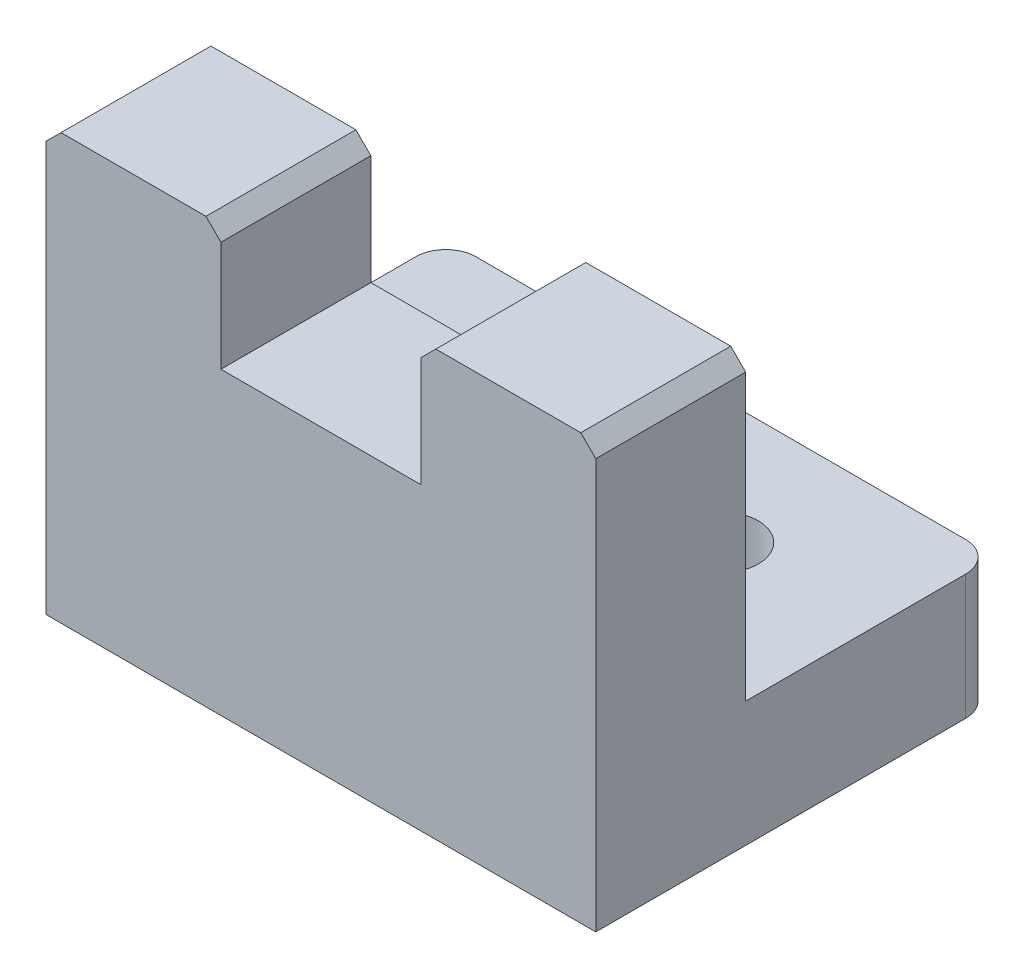
ISO-10303-21;
HEADER;
FILE_DESCRIPTION(('STEP AP214'),'2;1');
FILE_NAME('part.step','',(''),(''),'','','');
FILE_SCHEMA(('AUTOMOTIVE_DESIGN { 1 0 10303 214 1 1 1 1 }'));
ENDSEC;
DATA;
#1=APPLICATION_CONTEXT('core data for automotive mechanical design processes');
#2=APPLICATION_PROTOCOL_DEFINITION('international standard','automotive_design',2000,#1);
#3=PRODUCT_CONTEXT('',#1,'mechanical');
#4=PRODUCT('Part','Part','',(#3));
#5=PRODUCT_RELATED_PRODUCT_CATEGORY('part','',(#4));
#6=PRODUCT_DEFINITION_FORMATION('','',#4);
#7=PRODUCT_DEFINITION_CONTEXT('part definition',#1,'design');
#8=PRODUCT_DEFINITION('design','',#6,#7);
#9=PRODUCT_DEFINITION_SHAPE('','',#8);
#10=(LENGTH_UNIT() NAMED_UNIT(*) SI_UNIT(.MILLI.,.METRE.));
#11=(NAMED_UNIT(*) PLANE_ANGLE_UNIT() SI_UNIT($,.RADIAN.));
#12=(NAMED_UNIT(*) SI_UNIT($,.STERADIAN.) SOLID_ANGLE_UNIT());
#13=UNCERTAINTY_MEASURE_WITH_UNIT(LENGTH_MEASURE(1.E-05),#10,'distance_accuracy_value','');
#14=(GEOMETRIC_REPRESENTATION_CONTEXT(3) GLOBAL_UNCERTAINTY_ASSIGNED_CONTEXT((#13)) GLOBAL_UNIT_ASSIGNED_CONTEXT((#10,
#11,#12)) REPRESENTATION_CONTEXT('',''));
#15=CARTESIAN_POINT('',(0.,0.,0.));
#16=DIRECTION('',(0.,0.,1.));
#17=DIRECTION('',(1.,0.,0.));
#18=AXIS2_PLACEMENT_3D('',#15,#16,#17);
#19=CARTESIAN_POINT('',(0.,72.5,0.));
#20=DIRECTION('',(0.,-1.,0.));
#21=DIRECTION('',(0.,0.,-1.));
#22=AXIS2_PLACEMENT_3D('',#19,#20,#21);
#23=PLANE('',#22);
#24=DIRECTION('',(1.,0.,0.));
#25=VECTOR('',#24,1.);
#26=CARTESIAN_POINT('',(-55.,72.5,40.));
#27=LINE('',#26,#25);
#28=CARTESIAN_POINT('',(23.,72.5,40.));
#29=VERTEX_POINT('',#28);
#30=CARTESIAN_POINT('',(52.,72.5,40.));
#31=VERTEX_POINT('',#30);
#32=EDGE_CURVE('E216',#29,#31,#27,.T.);
#33=ORIENTED_EDGE('',*,*,#32,.T.);
#34=DIRECTION('',(0.,0.,-1.));
#35=VECTOR('',#34,1.);
#36=CARTESIAN_POINT('',(52.,72.5,0.));
#37=LINE('',#36,#35);
#38=CARTESIAN_POINT('',(52.,72.5,10.));
#39=VERTEX_POINT('',#38);
#40=EDGE_CURVE('E263',#31,#39,#37,.T.);
#41=ORIENTED_EDGE('',*,*,#40,.T.);
#42=DIRECTION('',(-1.,0.,0.));
#43=VECTOR('',#42,1.);
#44=CARTESIAN_POINT('',(-55.,72.5,10.));
#45=LINE('',#44,#43);
#46=CARTESIAN_POINT('',(23.,72.5,10.));
#47=VERTEX_POINT('',#46);
#48=EDGE_CURVE('E220',#39,#47,#45,.T.);
#49=ORIENTED_EDGE('',*,*,#48,.T.);
#50=DIRECTION('',(0.,0.,1.));
#51=VECTOR('',#50,1.);
#52=CARTESIAN_POINT('',(23.,72.5,0.));
#53=LINE('',#52,#51);
#54=EDGE_CURVE('E260',#47,#29,#53,.T.);
#55=ORIENTED_EDGE('',*,*,#54,.T.);
#56=EDGE_LOOP('',(#33,#41,#49,#55));
#57=FACE_BOUND('',#56,.T.);
#58=ADVANCED_FACE('F47',(#57),#23,.F.);
#59=CARTESIAN_POINT('',(-55.,12.5,-40.));
#60=DIRECTION('',(1.,0.,0.));
#61=DIRECTION('',(0.,0.,-1.));
#62=AXIS2_PLACEMENT_3D('',#59,#60,#61);
#63=PLANE('',#62);
#64=DIRECTION('',(0.,0.,1.));
#65=VECTOR('',#64,1.);
#66=CARTESIAN_POINT('',(-55.,12.5,-40.));
#67=LINE('',#66,#65);
#68=CARTESIAN_POINT('',(-55.,12.5,-34.));
#69=VERTEX_POINT('',#68);
#70=CARTESIAN_POINT('',(-55.,12.5,10.));
#71=VERTEX_POINT('',#70);
#72=EDGE_CURVE('E232',#69,#71,#67,.T.);
#73=ORIENTED_EDGE('',*,*,#72,.F.);
#74=DIRECTION('',(0.,-1.,0.));
#75=VECTOR('',#74,1.);
#76=CARTESIAN_POINT('',(-55.,12.5,-34.));
#77=LINE('',#76,#75);
#78=CARTESIAN_POINT('',(-55.,-12.5,-34.));
#79=VERTEX_POINT('',#78);
#80=EDGE_CURVE('E310',#69,#79,#77,.T.);
#81=ORIENTED_EDGE('',*,*,#80,.T.);
#82=DIRECTION('',(0.,0.,1.));
#83=VECTOR('',#82,1.);
#84=CARTESIAN_POINT('',(-55.,-12.5,-40.));
#85=LINE('',#84,#83);
#86=CARTESIAN_POINT('',(-55.,-12.5,40.));
#87=VERTEX_POINT('',#86);
#88=EDGE_CURVE('E231',#79,#87,#85,.T.);
#89=ORIENTED_EDGE('',*,*,#88,.T.);
#90=DIRECTION('',(0.,-1.,0.));
#91=VECTOR('',#90,1.);
#92=CARTESIAN_POINT('',(-55.,12.5,40.));
#93=LINE('',#92,#91);
#94=CARTESIAN_POINT('',(-55.,69.5,40.));
#95=VERTEX_POINT('',#94);
#96=EDGE_CURVE('E256',#95,#87,#93,.T.);
#97=ORIENTED_EDGE('',*,*,#96,.F.);
#98=DIRECTION('',(0.,0.,-1.));
#99=VECTOR('',#98,1.);
#100=CARTESIAN_POINT('',(-55.,69.5,-40.));
#101=LINE('',#100,#99);
#102=CARTESIAN_POINT('',(-55.,69.5,10.));
#103=VERTEX_POINT('',#102);
#104=EDGE_CURVE('E304',#95,#103,#101,.T.);
#105=ORIENTED_EDGE('',*,*,#104,.T.);
#106=DIRECTION('',(0.,-1.,0.));
#107=VECTOR('',#106,1.);
#108=CARTESIAN_POINT('',(-55.,72.5,10.));
#109=LINE('',#108,#107);
#110=EDGE_CURVE('E224',#103,#71,#109,.T.);
#111=ORIENTED_EDGE('',*,*,#110,.T.);
#112=EDGE_LOOP('',(#73,#81,#89,#97,#105,#111));
#113=FACE_BOUND('',#112,.T.);
#114=ADVANCED_FACE('F337',(#113),#63,.F.);
#115=CARTESIAN_POINT('',(-55.,12.5,40.));
#116=DIRECTION('',(0.,0.,-1.));
#117=DIRECTION('',(-1.,0.,0.));
#118=AXIS2_PLACEMENT_3D('',#115,#116,#117);
#119=PLANE('',#118);
#120=DIRECTION('',(0.,-1.,0.));
#121=VECTOR('',#120,1.);
#122=CARTESIAN_POINT('',(55.,12.5,40.));
#123=LINE('',#122,#121);
#124=CARTESIAN_POINT('',(55.,69.5,40.));
#125=VERTEX_POINT('',#124);
#126=CARTESIAN_POINT('',(55.,-12.5,40.));
#127=VERTEX_POINT('',#126);
#128=EDGE_CURVE('E242',#125,#127,#123,.T.);
#129=ORIENTED_EDGE('',*,*,#128,.F.);
#130=DIRECTION('',(0.707106781186548,-0.707106781186548,0.));
#131=VECTOR('',#130,1.);
#132=CARTESIAN_POINT('',(52.,72.5,40.));
#133=LINE('',#132,#131);
#134=EDGE_CURVE('E290',#125,#31,#133,.F.);
#135=ORIENTED_EDGE('',*,*,#134,.T.);
#136=ORIENTED_EDGE('',*,*,#32,.F.);
#137=DIRECTION('',(0.707106781186548,0.707106781186548,0.));
#138=VECTOR('',#137,1.);
#139=CARTESIAN_POINT('',(20.,69.5,40.));
#140=LINE('',#139,#138);
#141=CARTESIAN_POINT('',(20.,69.5,40.));
#142=VERTEX_POINT('',#141);
#143=EDGE_CURVE('E172',#29,#142,#140,.F.);
#144=ORIENTED_EDGE('',*,*,#143,.T.);
#145=DIRECTION('',(0.,-1.,0.));
#146=VECTOR('',#145,1.);
#147=CARTESIAN_POINT('',(20.,72.5,40.));
#148=LINE('',#147,#146);
#149=CARTESIAN_POINT('',(20.,47.5,40.));
#150=VERTEX_POINT('',#149);
#151=EDGE_CURVE('E163',#142,#150,#148,.T.);
#152=ORIENTED_EDGE('',*,*,#151,.T.);
#153=DIRECTION('',(-1.,0.,0.));
#154=VECTOR('',#153,1.);
#155=CARTESIAN_POINT('',(20.,47.5,40.));
#156=LINE('',#155,#154);
#157=CARTESIAN_POINT('',(-20.,47.5,40.));
#158=VERTEX_POINT('',#157);
#159=EDGE_CURVE('E169',#150,#158,#156,.T.);
#160=ORIENTED_EDGE('',*,*,#159,.T.);
#161=DIRECTION('',(0.,1.,0.));
#162=VECTOR('',#161,1.);
#163=CARTESIAN_POINT('',(-20.,72.5,40.));
#164=LINE('',#163,#162);
#165=CARTESIAN_POINT('',(-20.,69.5,40.));
#166=VERTEX_POINT('',#165);
#167=EDGE_CURVE('E189',#158,#166,#164,.T.);
#168=ORIENTED_EDGE('',*,*,#167,.T.);
#169=DIRECTION('',(0.707106781186548,-0.707106781186548,0.));
#170=VECTOR('',#169,1.);
#171=CARTESIAN_POINT('',(-23.,72.5,40.));
#172=LINE('',#171,#170);
#173=CARTESIAN_POINT('',(-23.,72.5,40.));
#174=VERTEX_POINT('',#173);
#175=EDGE_CURVE('E282',#166,#174,#172,.F.);
#176=ORIENTED_EDGE('',*,*,#175,.T.);
#177=CARTESIAN_POINT('',(-52.,72.5,40.));
#178=VERTEX_POINT('',#177);
#179=EDGE_CURVE('E211',#178,#174,#27,.T.);
#180=ORIENTED_EDGE('',*,*,#179,.F.);
#181=DIRECTION('',(0.707106781186548,0.707106781186548,0.));
#182=VECTOR('',#181,1.);
#183=CARTESIAN_POINT('',(-52.,72.5,40.));
#184=LINE('',#183,#182);
#185=EDGE_CURVE('E285',#178,#95,#184,.F.);
#186=ORIENTED_EDGE('',*,*,#185,.T.);
#187=ORIENTED_EDGE('',*,*,#96,.T.);
#188=DIRECTION('',(1.,0.,0.));
#189=VECTOR('',#188,1.);
#190=CARTESIAN_POINT('',(-55.,-12.5,40.));
#191=LINE('',#190,#189);
#192=EDGE_CURVE('E245',#87,#127,#191,.T.);
#193=ORIENTED_EDGE('',*,*,#192,.T.);
#194=EDGE_LOOP('',(#129,#135,#136,#144,#152,#160,#168,#176,#180,#186,#187,#193));
#195=FACE_BOUND('',#194,.T.);
#196=ADVANCED_FACE('F166',(#195),#119,.F.);
#197=CARTESIAN_POINT('',(55.,12.5,-40.));
#198=DIRECTION('',(-1.,0.,0.));
#199=DIRECTION('',(0.,0.,1.));
#200=AXIS2_PLACEMENT_3D('',#197,#198,#199);
#201=PLANE('',#200);
#202=DIRECTION('',(0.,0.,-1.));
#203=VECTOR('',#202,1.);
#204=CARTESIAN_POINT('',(55.,-12.5,-40.));
#205=LINE('',#204,#203);
#206=CARTESIAN_POINT('',(55.,-12.5,-34.));
#207=VERTEX_POINT('',#206);
#208=EDGE_CURVE('E249',#127,#207,#205,.T.);
#209=ORIENTED_EDGE('',*,*,#208,.T.);
#210=DIRECTION('',(0.,-1.,0.));
#211=VECTOR('',#210,1.);
#212=CARTESIAN_POINT('',(55.,12.5,-34.));
#213=LINE('',#212,#211);
#214=CARTESIAN_POINT('',(55.,12.5,-34.));
#215=VERTEX_POINT('',#214);
#216=EDGE_CURVE('E11',#207,#215,#213,.F.);
#217=ORIENTED_EDGE('',*,*,#216,.T.);
#218=DIRECTION('',(0.,0.,-1.));
#219=VECTOR('',#218,1.);
#220=CARTESIAN_POINT('',(55.,12.5,-40.));
#221=LINE('',#220,#219);
#222=CARTESIAN_POINT('',(55.,12.5,10.));
#223=VERTEX_POINT('',#222);
#224=EDGE_CURVE('E235',#223,#215,#221,.T.);
#225=ORIENTED_EDGE('',*,*,#224,.F.);
#226=DIRECTION('',(0.,-1.,0.));
#227=VECTOR('',#226,1.);
#228=CARTESIAN_POINT('',(55.,72.5,10.));
#229=LINE('',#228,#227);
#230=CARTESIAN_POINT('',(55.,69.5,10.));
#231=VERTEX_POINT('',#230);
#232=EDGE_CURVE('E228',#231,#223,#229,.T.);
#233=ORIENTED_EDGE('',*,*,#232,.F.);
#234=DIRECTION('',(0.,0.,1.));
#235=VECTOR('',#234,1.);
#236=CARTESIAN_POINT('',(55.,69.5,-40.));
#237=LINE('',#236,#235);
#238=EDGE_CURVE('E279',#231,#125,#237,.T.);
#239=ORIENTED_EDGE('',*,*,#238,.T.);
#240=ORIENTED_EDGE('',*,*,#128,.T.);
#241=EDGE_LOOP('',(#209,#217,#225,#233,#239,#240));
#242=FACE_BOUND('',#241,.T.);
#243=ADVANCED_FACE('F350',(#242),#201,.F.);
#244=CARTESIAN_POINT('',(-55.,12.5,-40.));
#245=DIRECTION('',(0.,0.,1.));
#246=DIRECTION('',(1.,0.,0.));
#247=AXIS2_PLACEMENT_3D('',#244,#245,#246);
#248=PLANE('',#247);
#249=DIRECTION('',(-1.,0.,0.));
#250=VECTOR('',#249,1.);
#251=CARTESIAN_POINT('',(-55.,-12.5,-40.));
#252=LINE('',#251,#250);
#253=CARTESIAN_POINT('',(49.,-12.5,-40.));
#254=VERTEX_POINT('',#253);
#255=CARTESIAN_POINT('',(-49.,-12.5,-40.));
#256=VERTEX_POINT('',#255);
#257=EDGE_CURVE('E236',#254,#256,#252,.T.);
#258=ORIENTED_EDGE('',*,*,#257,.T.);
#259=DIRECTION('',(0.,-1.,0.));
#260=VECTOR('',#259,1.);
#261=CARTESIAN_POINT('',(-49.,12.5,-40.));
#262=LINE('',#261,#260);
#263=CARTESIAN_POINT('',(-49.,12.5,-40.));
#264=VERTEX_POINT('',#263);
#265=EDGE_CURVE('E69',#256,#264,#262,.F.);
#266=ORIENTED_EDGE('',*,*,#265,.T.);
#267=DIRECTION('',(-1.,0.,0.));
#268=VECTOR('',#267,1.);
#269=CARTESIAN_POINT('',(-55.,12.5,-40.));
#270=LINE('',#269,#268);
#271=CARTESIAN_POINT('',(49.,12.5,-40.));
#272=VERTEX_POINT('',#271);
#273=EDGE_CURVE('E239',#272,#264,#270,.T.);
#274=ORIENTED_EDGE('',*,*,#273,.F.);
#275=DIRECTION('',(0.,-1.,0.));
#276=VECTOR('',#275,1.);
#277=CARTESIAN_POINT('',(49.,12.5,-40.));
#278=LINE('',#277,#276);
#279=EDGE_CURVE('E320',#272,#254,#278,.T.);
#280=ORIENTED_EDGE('',*,*,#279,.T.);
#281=EDGE_LOOP('',(#258,#266,#274,#280));
#282=FACE_BOUND('',#281,.T.);
#283=ADVANCED_FACE('F345',(#282),#248,.F.);
#284=CARTESIAN_POINT('',(0.,12.5,0.));
#285=DIRECTION('',(0.,1.,0.));
#286=DIRECTION('',(0.,0.,1.));
#287=AXIS2_PLACEMENT_3D('',#284,#285,#286);
#288=PLANE('',#287);
#289=CARTESIAN_POINT('',(25.,12.5,-15.));
#290=DIRECTION('',(0.,1.,0.));
#291=DIRECTION('',(0.,0.,1.));
#292=AXIS2_PLACEMENT_3D('',#289,#290,#291);
#293=CIRCLE('',#292,7.49999999999999);
#294=CARTESIAN_POINT('',(25.,12.5,-7.50000000000001));
#295=VERTEX_POINT('',#294);
#296=EDGE_CURVE('E582',#295,#295,#293,.T.);
#297=ORIENTED_EDGE('',*,*,#296,.F.);
#298=EDGE_LOOP('',(#297));
#299=FACE_BOUND('',#298,.T.);
#300=CARTESIAN_POINT('',(-25.,12.5,-15.));
#301=DIRECTION('',(0.,1.,0.));
#302=DIRECTION('',(0.,0.,1.));
#303=AXIS2_PLACEMENT_3D('',#300,#301,#302);
#304=CIRCLE('',#303,7.49999999999999);
#305=CARTESIAN_POINT('',(-25.,12.5,-7.50000000000001));
#306=VERTEX_POINT('',#305);
#307=EDGE_CURVE('E574',#306,#306,#304,.T.);
#308=ORIENTED_EDGE('',*,*,#307,.F.);
#309=EDGE_LOOP('',(#308));
#310=FACE_BOUND('',#309,.T.);
#311=ORIENTED_EDGE('',*,*,#273,.T.);
#312=CARTESIAN_POINT('',(-49.,12.5,-34.));
#313=DIRECTION('',(0.,1.,0.));
#314=DIRECTION('',(0.,0.,1.));
#315=AXIS2_PLACEMENT_3D('',#312,#313,#314);
#316=CIRCLE('',#315,6.);
#317=EDGE_CURVE('E56',#264,#69,#316,.T.);
#318=ORIENTED_EDGE('',*,*,#317,.T.);
#319=ORIENTED_EDGE('',*,*,#72,.T.);
#320=DIRECTION('',(-1.,0.,0.));
#321=VECTOR('',#320,1.);
#322=CARTESIAN_POINT('',(-55.,12.5,10.));
#323=LINE('',#322,#321);
#324=EDGE_CURVE('E209',#223,#71,#323,.T.);
#325=ORIENTED_EDGE('',*,*,#324,.F.);
#326=ORIENTED_EDGE('',*,*,#224,.T.);
#327=CARTESIAN_POINT('',(49.,12.5,-34.));
#328=DIRECTION('',(0.,1.,0.));
#329=DIRECTION('',(0.,0.,1.));
#330=AXIS2_PLACEMENT_3D('',#327,#328,#329);
#331=CIRCLE('',#330,6.);
#332=EDGE_CURVE('E326',#215,#272,#331,.T.);
#333=ORIENTED_EDGE('',*,*,#332,.T.);
#334=EDGE_LOOP('',(#311,#318,#319,#325,#326,#333));
#335=FACE_BOUND('',#334,.T.);
#336=ADVANCED_FACE('F332',(#299,#310,#335),#288,.T.);
#337=CARTESIAN_POINT('',(0.,-12.5,0.));
#338=DIRECTION('',(0.,1.,0.));
#339=DIRECTION('',(0.,0.,1.));
#340=AXIS2_PLACEMENT_3D('',#337,#338,#339);
#341=PLANE('',#340);
#342=CARTESIAN_POINT('',(25.,-12.5,-15.));
#343=DIRECTION('',(0.,1.,0.));
#344=DIRECTION('',(0.,0.,1.));
#345=AXIS2_PLACEMENT_3D('',#342,#343,#344);
#346=CIRCLE('',#345,7.49999999999999);
#347=CARTESIAN_POINT('',(25.,-12.5,-7.50000000000001));
#348=VERTEX_POINT('',#347);
#349=EDGE_CURVE('E577',#348,#348,#346,.T.);
#350=ORIENTED_EDGE('',*,*,#349,.T.);
#351=EDGE_LOOP('',(#350));
#352=FACE_BOUND('',#351,.T.);
#353=CARTESIAN_POINT('',(-25.,-12.5,-15.));
#354=DIRECTION('',(0.,1.,0.));
#355=DIRECTION('',(0.,0.,1.));
#356=AXIS2_PLACEMENT_3D('',#353,#354,#355);
#357=CIRCLE('',#356,7.49999999999999);
#358=CARTESIAN_POINT('',(-25.,-12.5,-7.5));
#359=VERTEX_POINT('',#358);
#360=EDGE_CURVE('E202',#359,#359,#357,.T.);
#361=ORIENTED_EDGE('',*,*,#360,.T.);
#362=EDGE_LOOP('',(#361));
#363=FACE_BOUND('',#362,.T.);
#364=ORIENTED_EDGE('',*,*,#88,.F.);
#365=CARTESIAN_POINT('',(-49.,-12.5,-34.));
#366=DIRECTION('',(0.,1.,0.));
#367=DIRECTION('',(0.,0.,1.));
#368=AXIS2_PLACEMENT_3D('',#365,#366,#367);
#369=CIRCLE('',#368,6.);
#370=EDGE_CURVE('E317',#79,#256,#369,.F.);
#371=ORIENTED_EDGE('',*,*,#370,.T.);
#372=ORIENTED_EDGE('',*,*,#257,.F.);
#373=CARTESIAN_POINT('',(49.,-12.5,-34.));
#374=DIRECTION('',(0.,1.,0.));
#375=DIRECTION('',(0.,0.,1.));
#376=AXIS2_PLACEMENT_3D('',#373,#374,#375);
#377=CIRCLE('',#376,6.);
#378=EDGE_CURVE('E314',#254,#207,#377,.F.);
#379=ORIENTED_EDGE('',*,*,#378,.T.);
#380=ORIENTED_EDGE('',*,*,#208,.F.);
#381=ORIENTED_EDGE('',*,*,#192,.F.);
#382=EDGE_LOOP('',(#364,#371,#372,#379,#380,#381));
#383=FACE_BOUND('',#382,.T.);
#384=ADVANCED_FACE('F343',(#352,#363,#383),#341,.F.);
#385=CARTESIAN_POINT('',(-55.,72.5,10.));
#386=DIRECTION('',(0.,0.,1.));
#387=DIRECTION('',(1.,0.,0.));
#388=AXIS2_PLACEMENT_3D('',#385,#386,#387);
#389=PLANE('',#388);
#390=ORIENTED_EDGE('',*,*,#48,.F.);
#391=DIRECTION('',(-0.707106781186548,0.707106781186548,0.));
#392=VECTOR('',#391,1.);
#393=CARTESIAN_POINT('',(52.,72.5,10.));
#394=LINE('',#393,#392);
#395=EDGE_CURVE('E276',#39,#231,#394,.F.);
#396=ORIENTED_EDGE('',*,*,#395,.T.);
#397=ORIENTED_EDGE('',*,*,#232,.T.);
#398=ORIENTED_EDGE('',*,*,#324,.T.);
#399=ORIENTED_EDGE('',*,*,#110,.F.);
#400=DIRECTION('',(-0.707106781186548,-0.707106781186548,0.));
#401=VECTOR('',#400,1.);
#402=CARTESIAN_POINT('',(-52.,72.5,10.));
#403=LINE('',#402,#401);
#404=CARTESIAN_POINT('',(-52.,72.5,10.));
#405=VERTEX_POINT('',#404);
#406=EDGE_CURVE('E270',#103,#405,#403,.F.);
#407=ORIENTED_EDGE('',*,*,#406,.T.);
#408=CARTESIAN_POINT('',(-23.,72.5,10.));
#409=VERTEX_POINT('',#408);
#410=EDGE_CURVE('E215',#409,#405,#45,.T.);
#411=ORIENTED_EDGE('',*,*,#410,.F.);
#412=DIRECTION('',(-0.707106781186548,0.707106781186548,0.));
#413=VECTOR('',#412,1.);
#414=CARTESIAN_POINT('',(-23.,72.5,10.));
#415=LINE('',#414,#413);
#416=CARTESIAN_POINT('',(-20.,69.5,10.));
#417=VERTEX_POINT('',#416);
#418=EDGE_CURVE('E267',#409,#417,#415,.F.);
#419=ORIENTED_EDGE('',*,*,#418,.T.);
#420=DIRECTION('',(0.,1.,0.));
#421=VECTOR('',#420,1.);
#422=CARTESIAN_POINT('',(-20.,72.5,10.));
#423=LINE('',#422,#421);
#424=CARTESIAN_POINT('',(-20.,47.5,10.));
#425=VERTEX_POINT('',#424);
#426=EDGE_CURVE('E177',#425,#417,#423,.T.);
#427=ORIENTED_EDGE('',*,*,#426,.F.);
#428=DIRECTION('',(-1.,0.,0.));
#429=VECTOR('',#428,1.);
#430=CARTESIAN_POINT('',(20.,47.5,10.));
#431=LINE('',#430,#429);
#432=CARTESIAN_POINT('',(20.,47.5,10.));
#433=VERTEX_POINT('',#432);
#434=EDGE_CURVE('E201',#433,#425,#431,.T.);
#435=ORIENTED_EDGE('',*,*,#434,.F.);
#436=DIRECTION('',(0.,-1.,0.));
#437=VECTOR('',#436,1.);
#438=CARTESIAN_POINT('',(20.,72.5,10.));
#439=LINE('',#438,#437);
#440=CARTESIAN_POINT('',(20.,69.5,10.));
#441=VERTEX_POINT('',#440);
#442=EDGE_CURVE('E183',#441,#433,#439,.T.);
#443=ORIENTED_EDGE('',*,*,#442,.F.);
#444=DIRECTION('',(-0.707106781186548,-0.707106781186548,0.));
#445=VECTOR('',#444,1.);
#446=CARTESIAN_POINT('',(20.,69.5,10.));
#447=LINE('',#446,#445);
#448=EDGE_CURVE('E273',#441,#47,#447,.F.);
#449=ORIENTED_EDGE('',*,*,#448,.T.);
#450=EDGE_LOOP('',(#390,#396,#397,#398,#399,#407,#411,#419,#427,#435,#443,#449));
#451=FACE_BOUND('',#450,.T.);
#452=ADVANCED_FACE('F364',(#451),#389,.F.);
#453=ORIENTED_EDGE('',*,*,#410,.T.);
#454=DIRECTION('',(0.,0.,1.));
#455=VECTOR('',#454,1.);
#456=CARTESIAN_POINT('',(-52.,72.5,0.));
#457=LINE('',#456,#455);
#458=EDGE_CURVE('E300',#405,#178,#457,.T.);
#459=ORIENTED_EDGE('',*,*,#458,.T.);
#460=ORIENTED_EDGE('',*,*,#179,.T.);
#461=DIRECTION('',(0.,0.,-1.));
#462=VECTOR('',#461,1.);
#463=CARTESIAN_POINT('',(-23.,72.5,0.));
#464=LINE('',#463,#462);
#465=EDGE_CURVE('E296',#174,#409,#464,.T.);
#466=ORIENTED_EDGE('',*,*,#465,.T.);
#467=EDGE_LOOP('',(#453,#459,#460,#466));
#468=FACE_BOUND('',#467,.T.);
#469=ADVANCED_FACE('F366',(#468),#23,.F.);
#470=CARTESIAN_POINT('',(20.,72.5,40.));
#471=DIRECTION('',(1.,0.,0.));
#472=DIRECTION('',(0.,1.,0.));
#473=AXIS2_PLACEMENT_3D('',#470,#471,#472);
#474=PLANE('',#473);
#475=ORIENTED_EDGE('',*,*,#151,.F.);
#476=DIRECTION('',(0.,0.,-1.));
#477=VECTOR('',#476,1.);
#478=CARTESIAN_POINT('',(20.,69.5,40.));
#479=LINE('',#478,#477);
#480=EDGE_CURVE('E293',#142,#441,#479,.T.);
#481=ORIENTED_EDGE('',*,*,#480,.T.);
#482=ORIENTED_EDGE('',*,*,#442,.T.);
#483=DIRECTION('',(0.,0.,-1.));
#484=VECTOR('',#483,1.);
#485=CARTESIAN_POINT('',(20.,47.5,40.));
#486=LINE('',#485,#484);
#487=EDGE_CURVE('E180',#150,#433,#486,.T.);
#488=ORIENTED_EDGE('',*,*,#487,.F.);
#489=EDGE_LOOP('',(#475,#481,#482,#488));
#490=FACE_BOUND('',#489,.T.);
#491=ADVANCED_FACE('F181',(#490),#474,.F.);
#492=CARTESIAN_POINT('',(-20.,72.5,40.));
#493=DIRECTION('',(-1.,0.,0.));
#494=DIRECTION('',(0.,-1.,0.));
#495=AXIS2_PLACEMENT_3D('',#492,#493,#494);
#496=PLANE('',#495);
#497=ORIENTED_EDGE('',*,*,#426,.T.);
#498=DIRECTION('',(0.,0.,1.));
#499=VECTOR('',#498,1.);
#500=CARTESIAN_POINT('',(-20.,69.5,40.));
#501=LINE('',#500,#499);
#502=EDGE_CURVE('E307',#417,#166,#501,.T.);
#503=ORIENTED_EDGE('',*,*,#502,.T.);
#504=ORIENTED_EDGE('',*,*,#167,.F.);
#505=DIRECTION('',(0.,0.,-1.));
#506=VECTOR('',#505,1.);
#507=CARTESIAN_POINT('',(-20.,47.5,40.));
#508=LINE('',#507,#506);
#509=EDGE_CURVE('E188',#158,#425,#508,.T.);
#510=ORIENTED_EDGE('',*,*,#509,.T.);
#511=EDGE_LOOP('',(#497,#503,#504,#510));
#512=FACE_BOUND('',#511,.T.);
#513=ADVANCED_FACE('F374',(#512),#496,.F.);
#514=CARTESIAN_POINT('',(20.,47.5,40.));
#515=DIRECTION('',(0.,-1.,0.));
#516=DIRECTION('',(1.,0.,0.));
#517=AXIS2_PLACEMENT_3D('',#514,#515,#516);
#518=PLANE('',#517);
#519=ORIENTED_EDGE('',*,*,#434,.T.);
#520=ORIENTED_EDGE('',*,*,#509,.F.);
#521=ORIENTED_EDGE('',*,*,#159,.F.);
#522=ORIENTED_EDGE('',*,*,#487,.T.);
#523=EDGE_LOOP('',(#519,#520,#521,#522));
#524=FACE_BOUND('',#523,.T.);
#525=ADVANCED_FACE('F191',(#524),#518,.F.);
#526=CARTESIAN_POINT('',(52.,72.5,0.));
#527=DIRECTION('',(-0.707106781186548,-0.707106781186548,0.));
#528=DIRECTION('',(0.,0.,-1.));
#529=AXIS2_PLACEMENT_3D('',#526,#527,#528);
#530=PLANE('',#529);
#531=ORIENTED_EDGE('',*,*,#134,.F.);
#532=ORIENTED_EDGE('',*,*,#238,.F.);
#533=ORIENTED_EDGE('',*,*,#395,.F.);
#534=ORIENTED_EDGE('',*,*,#40,.F.);
#535=EDGE_LOOP('',(#531,#532,#533,#534));
#536=FACE_BOUND('',#535,.T.);
#537=ADVANCED_FACE('F384',(#536),#530,.F.);
#538=CARTESIAN_POINT('',(20.,69.5,40.));
#539=DIRECTION('',(0.707106781186547,-0.707106781186547,0.));
#540=DIRECTION('',(0.,0.,-1.));
#541=AXIS2_PLACEMENT_3D('',#538,#539,#540);
#542=PLANE('',#541);
#543=ORIENTED_EDGE('',*,*,#143,.F.);
#544=ORIENTED_EDGE('',*,*,#54,.F.);
#545=ORIENTED_EDGE('',*,*,#448,.F.);
#546=ORIENTED_EDGE('',*,*,#480,.F.);
#547=EDGE_LOOP('',(#543,#544,#545,#546));
#548=FACE_BOUND('',#547,.T.);
#549=ADVANCED_FACE('F382',(#548),#542,.F.);
#550=CARTESIAN_POINT('',(-52.,72.5,0.));
#551=DIRECTION('',(0.707106781186548,-0.707106781186548,0.));
#552=DIRECTION('',(0.,0.,1.));
#553=AXIS2_PLACEMENT_3D('',#550,#551,#552);
#554=PLANE('',#553);
#555=ORIENTED_EDGE('',*,*,#406,.F.);
#556=ORIENTED_EDGE('',*,*,#104,.F.);
#557=ORIENTED_EDGE('',*,*,#185,.F.);
#558=ORIENTED_EDGE('',*,*,#458,.F.);
#559=EDGE_LOOP('',(#555,#556,#557,#558));
#560=FACE_BOUND('',#559,.T.);
#561=ADVANCED_FACE('F359',(#560),#554,.F.);
#562=CARTESIAN_POINT('',(-23.,72.5,0.));
#563=DIRECTION('',(-0.707106781186548,-0.707106781186548,0.));
#564=DIRECTION('',(0.,0.,-1.));
#565=AXIS2_PLACEMENT_3D('',#562,#563,#564);
#566=PLANE('',#565);
#567=ORIENTED_EDGE('',*,*,#175,.F.);
#568=ORIENTED_EDGE('',*,*,#502,.F.);
#569=ORIENTED_EDGE('',*,*,#418,.F.);
#570=ORIENTED_EDGE('',*,*,#465,.F.);
#571=EDGE_LOOP('',(#567,#568,#569,#570));
#572=FACE_BOUND('',#571,.T.);
#573=ADVANCED_FACE('F370',(#572),#566,.F.);
#574=CARTESIAN_POINT('',(-49.,12.5,-34.));
#575=DIRECTION('',(0.,-1.,0.));
#576=DIRECTION('',(0.,0.,-1.));
#577=AXIS2_PLACEMENT_3D('',#574,#575,#576);
#578=CYLINDRICAL_SURFACE('',#577,6.);
#579=ORIENTED_EDGE('',*,*,#317,.F.);
#580=ORIENTED_EDGE('',*,*,#265,.F.);
#581=ORIENTED_EDGE('',*,*,#370,.F.);
#582=ORIENTED_EDGE('',*,*,#80,.F.);
#583=EDGE_LOOP('',(#579,#580,#581,#582));
#584=FACE_BOUND('',#583,.T.);
#585=ADVANCED_FACE('F340',(#584),#578,.T.);
#586=CARTESIAN_POINT('',(49.,12.5,-34.));
#587=DIRECTION('',(0.,-1.,0.));
#588=DIRECTION('',(0.,0.,-1.));
#589=AXIS2_PLACEMENT_3D('',#586,#587,#588);
#590=CYLINDRICAL_SURFACE('',#589,6.);
#591=ORIENTED_EDGE('',*,*,#332,.F.);
#592=ORIENTED_EDGE('',*,*,#216,.F.);
#593=ORIENTED_EDGE('',*,*,#378,.F.);
#594=ORIENTED_EDGE('',*,*,#279,.F.);
#595=EDGE_LOOP('',(#591,#592,#593,#594));
#596=FACE_BOUND('',#595,.T.);
#597=ADVANCED_FACE('F49',(#596),#590,.T.);
#598=CARTESIAN_POINT('',(-25.,12.5,-15.));
#599=DIRECTION('',(0.,1.,0.));
#600=DIRECTION('',(0.,0.,1.));
#601=AXIS2_PLACEMENT_3D('',#598,#599,#600);
#602=CYLINDRICAL_SURFACE('',#601,7.49999999999999);
#603=ORIENTED_EDGE('',*,*,#360,.F.);
#604=EDGE_LOOP('',(#603));
#605=FACE_BOUND('',#604,.T.);
#606=ORIENTED_EDGE('',*,*,#307,.T.);
#607=EDGE_LOOP('',(#606));
#608=FACE_BOUND('',#607,.T.);
#609=ADVANCED_FACE('F439',(#605,#608),#602,.F.);
#610=CARTESIAN_POINT('',(25.,12.5,-15.));
#611=DIRECTION('',(0.,1.,0.));
#612=DIRECTION('',(0.,0.,1.));
#613=AXIS2_PLACEMENT_3D('',#610,#611,#612);
#614=CYLINDRICAL_SURFACE('',#613,7.49999999999999);
#615=ORIENTED_EDGE('',*,*,#349,.F.);
#616=EDGE_LOOP('',(#615));
#617=FACE_BOUND('',#616,.T.);
#618=ORIENTED_EDGE('',*,*,#296,.T.);
#619=EDGE_LOOP('',(#618));
#620=FACE_BOUND('',#619,.T.);
#621=ADVANCED_FACE('F443',(#617,#620),#614,.F.);
#622=CLOSED_SHELL('',(#58,#114,#196,#243,#283,#336,#384,#452,#469,#491,#513,#525,#537,#549,#561,
#573,#585,#597,#609,#621));
#623=MANIFOLD_SOLID_BREP('B2',#622);
#624=ADVANCED_BREP_SHAPE_REPRESENTATION('',(#18,#623),#14);
#625=SHAPE_DEFINITION_REPRESENTATION(#9,#624);
ENDSEC;
END-ISO-10303-21;
